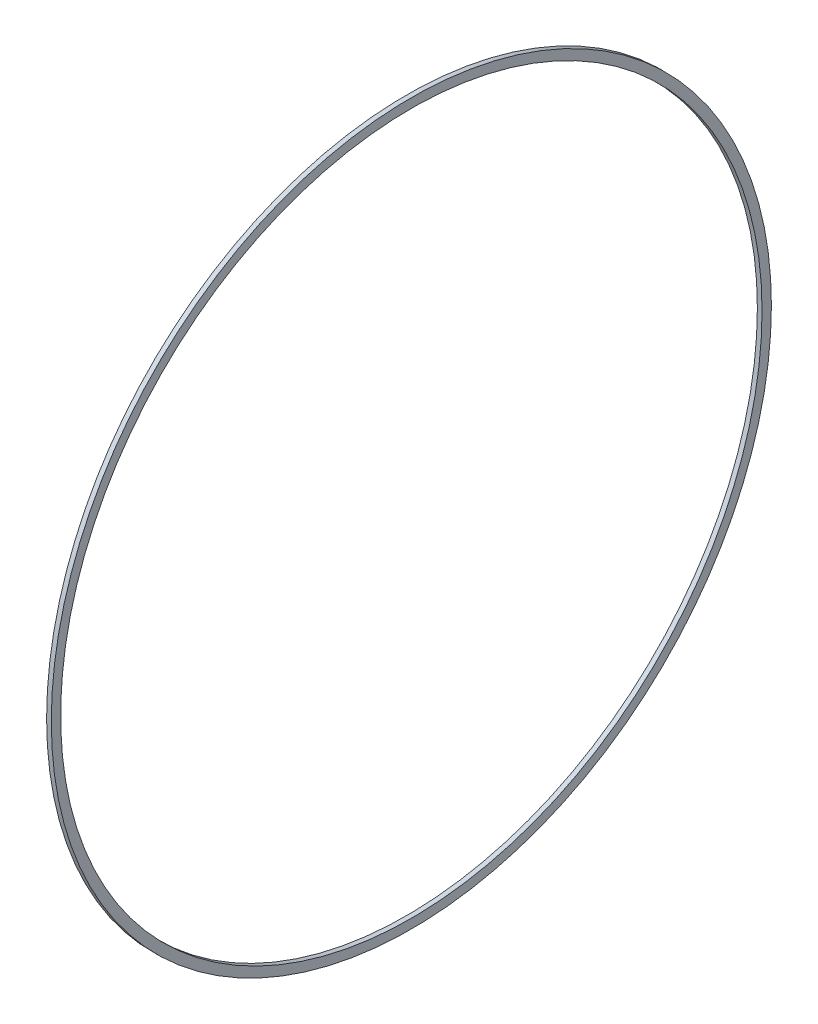
ISO-10303-21;
HEADER;
FILE_DESCRIPTION(('STEP AP214'),'2;1');
FILE_NAME('part.step','',(''),(''),'','','');
FILE_SCHEMA(('AUTOMOTIVE_DESIGN { 1 0 10303 214 1 1 1 1 }'));
ENDSEC;
DATA;
#1=APPLICATION_CONTEXT('core data for automotive mechanical design processes');
#2=APPLICATION_PROTOCOL_DEFINITION('international standard','automotive_design',2000,#1);
#3=PRODUCT_CONTEXT('',#1,'mechanical');
#4=PRODUCT('Part','Part','',(#3));
#5=PRODUCT_RELATED_PRODUCT_CATEGORY('part','',(#4));
#6=PRODUCT_DEFINITION_FORMATION('','',#4);
#7=PRODUCT_DEFINITION_CONTEXT('part definition',#1,'design');
#8=PRODUCT_DEFINITION('design','',#6,#7);
#9=PRODUCT_DEFINITION_SHAPE('','',#8);
#10=(LENGTH_UNIT() NAMED_UNIT(*) SI_UNIT(.MILLI.,.METRE.));
#11=(NAMED_UNIT(*) PLANE_ANGLE_UNIT() SI_UNIT($,.RADIAN.));
#12=(NAMED_UNIT(*) SI_UNIT($,.STERADIAN.) SOLID_ANGLE_UNIT());
#13=UNCERTAINTY_MEASURE_WITH_UNIT(LENGTH_MEASURE(1.E-05),#10,'distance_accuracy_value','');
#14=(GEOMETRIC_REPRESENTATION_CONTEXT(3) GLOBAL_UNCERTAINTY_ASSIGNED_CONTEXT((#13)) GLOBAL_UNIT_ASSIGNED_CONTEXT((#10,
#11,#12)) REPRESENTATION_CONTEXT('',''));
#15=CARTESIAN_POINT('',(0.,0.,0.));
#16=DIRECTION('',(0.,0.,1.));
#17=DIRECTION('',(1.,0.,0.));
#18=AXIS2_PLACEMENT_3D('',#15,#16,#17);
#19=CARTESIAN_POINT('',(10.,0.,0.));
#20=DIRECTION('',(1.,0.,0.));
#21=DIRECTION('',(0.,0.,-1.));
#22=AXIS2_PLACEMENT_3D('',#19,#20,#21);
#23=PLANE('',#22);
#24=CARTESIAN_POINT('',(10.,0.,0.));
#25=DIRECTION('',(1.,0.,0.));
#26=DIRECTION('',(0.,0.,-1.));
#27=AXIS2_PLACEMENT_3D('',#24,#25,#26);
#28=CIRCLE('',#27,770.);
#29=CARTESIAN_POINT('',(10.,0.,-770.));
#30=VERTEX_POINT('',#29);
#31=EDGE_CURVE('E10',#30,#30,#28,.T.);
#32=ORIENTED_EDGE('',*,*,#31,.T.);
#33=EDGE_LOOP('',(#32));
#34=FACE_BOUND('',#33,.T.);
#35=CARTESIAN_POINT('',(10.,0.,0.));
#36=DIRECTION('',(1.,0.,0.));
#37=DIRECTION('',(0.,0.,-1.));
#38=AXIS2_PLACEMENT_3D('',#35,#36,#37);
#39=CIRCLE('',#38,750.);
#40=CARTESIAN_POINT('',(10.,0.,-750.));
#41=VERTEX_POINT('',#40);
#42=EDGE_CURVE('E41',#41,#41,#39,.T.);
#43=ORIENTED_EDGE('',*,*,#42,.F.);
#44=EDGE_LOOP('',(#43));
#45=FACE_BOUND('',#44,.T.);
#46=ADVANCED_FACE('F30',(#34,#45),#23,.T.);
#47=CARTESIAN_POINT('',(0.,0.,0.));
#48=DIRECTION('',(1.,0.,0.));
#49=DIRECTION('',(0.,0.,-1.));
#50=AXIS2_PLACEMENT_3D('',#47,#48,#49);
#51=PLANE('',#50);
#52=CARTESIAN_POINT('',(0.,0.,0.));
#53=DIRECTION('',(1.,0.,0.));
#54=DIRECTION('',(0.,0.,-1.));
#55=AXIS2_PLACEMENT_3D('',#52,#53,#54);
#56=CIRCLE('',#55,770.);
#57=CARTESIAN_POINT('',(0.,0.,-770.));
#58=VERTEX_POINT('',#57);
#59=EDGE_CURVE('E34',#58,#58,#56,.T.);
#60=ORIENTED_EDGE('',*,*,#59,.F.);
#61=EDGE_LOOP('',(#60));
#62=FACE_BOUND('',#61,.T.);
#63=CARTESIAN_POINT('',(0.,0.,0.));
#64=DIRECTION('',(1.,0.,0.));
#65=DIRECTION('',(0.,0.,-1.));
#66=AXIS2_PLACEMENT_3D('',#63,#64,#65);
#67=CIRCLE('',#66,750.);
#68=CARTESIAN_POINT('',(0.,0.,-750.));
#69=VERTEX_POINT('',#68);
#70=EDGE_CURVE('E43',#69,#69,#67,.T.);
#71=ORIENTED_EDGE('',*,*,#70,.T.);
#72=EDGE_LOOP('',(#71));
#73=FACE_BOUND('',#72,.T.);
#74=ADVANCED_FACE('F53',(#62,#73),#51,.F.);
#75=CARTESIAN_POINT('',(10.,0.,0.));
#76=DIRECTION('',(-1.,0.,0.));
#77=DIRECTION('',(0.,0.,1.));
#78=AXIS2_PLACEMENT_3D('',#75,#76,#77);
#79=CYLINDRICAL_SURFACE('',#78,770.);
#80=ORIENTED_EDGE('',*,*,#31,.F.);
#81=EDGE_LOOP('',(#80));
#82=FACE_BOUND('',#81,.T.);
#83=ORIENTED_EDGE('',*,*,#59,.T.);
#84=EDGE_LOOP('',(#83));
#85=FACE_BOUND('',#84,.T.);
#86=ADVANCED_FACE('F32',(#82,#85),#79,.T.);
#87=CARTESIAN_POINT('',(10.,0.,0.));
#88=DIRECTION('',(-1.,0.,0.));
#89=DIRECTION('',(0.,0.,1.));
#90=AXIS2_PLACEMENT_3D('',#87,#88,#89);
#91=CYLINDRICAL_SURFACE('',#90,750.);
#92=ORIENTED_EDGE('',*,*,#42,.T.);
#93=EDGE_LOOP('',(#92));
#94=FACE_BOUND('',#93,.T.);
#95=ORIENTED_EDGE('',*,*,#70,.F.);
#96=EDGE_LOOP('',(#95));
#97=FACE_BOUND('',#96,.T.);
#98=ADVANCED_FACE('F49',(#94,#97),#91,.F.);
#99=CLOSED_SHELL('',(#46,#74,#86,#98));
#100=MANIFOLD_SOLID_BREP('B2',#99);
#101=ADVANCED_BREP_SHAPE_REPRESENTATION('',(#18,#100),#14);
#102=SHAPE_DEFINITION_REPRESENTATION(#9,#101);
ENDSEC;
END-ISO-10303-21;
